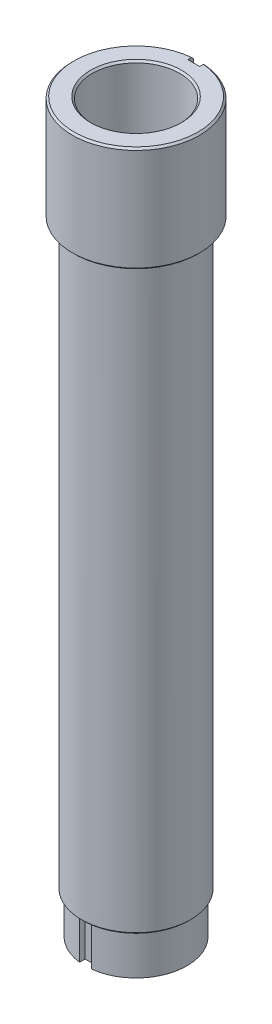
ISO-10303-21;
HEADER;
FILE_DESCRIPTION(('STEP AP214'),'2;1');
FILE_NAME('part.step','',(''),(''),'','','');
FILE_SCHEMA(('AUTOMOTIVE_DESIGN { 1 0 10303 214 1 1 1 1 }'));
ENDSEC;
DATA;
#1=APPLICATION_CONTEXT('core data for automotive mechanical design processes');
#2=APPLICATION_PROTOCOL_DEFINITION('international standard','automotive_design',2000,#1);
#3=PRODUCT_CONTEXT('',#1,'mechanical');
#4=PRODUCT('Part','Part','',(#3));
#5=PRODUCT_RELATED_PRODUCT_CATEGORY('part','',(#4));
#6=PRODUCT_DEFINITION_FORMATION('','',#4);
#7=PRODUCT_DEFINITION_CONTEXT('part definition',#1,'design');
#8=PRODUCT_DEFINITION('design','',#6,#7);
#9=PRODUCT_DEFINITION_SHAPE('','',#8);
#10=(LENGTH_UNIT() NAMED_UNIT(*) SI_UNIT(.MILLI.,.METRE.));
#11=(NAMED_UNIT(*) PLANE_ANGLE_UNIT() SI_UNIT($,.RADIAN.));
#12=(NAMED_UNIT(*) SI_UNIT($,.STERADIAN.) SOLID_ANGLE_UNIT());
#13=UNCERTAINTY_MEASURE_WITH_UNIT(LENGTH_MEASURE(1.E-05),#10,'distance_accuracy_value','');
#14=(GEOMETRIC_REPRESENTATION_CONTEXT(3) GLOBAL_UNCERTAINTY_ASSIGNED_CONTEXT((#13)) GLOBAL_UNIT_ASSIGNED_CONTEXT((#10,
#11,#12)) REPRESENTATION_CONTEXT('',''));
#15=CARTESIAN_POINT('',(0.,0.,0.));
#16=DIRECTION('',(0.,0.,1.));
#17=DIRECTION('',(1.,0.,0.));
#18=AXIS2_PLACEMENT_3D('',#15,#16,#17);
#19=CARTESIAN_POINT('',(0.,0.,0.));
#20=DIRECTION('',(0.,-1.,0.));
#21=DIRECTION('',(0.,0.,-1.));
#22=AXIS2_PLACEMENT_3D('',#19,#20,#21);
#23=CYLINDRICAL_SURFACE('',#22,15.);
#24=CARTESIAN_POINT('',(0.,170.5,0.));
#25=DIRECTION('',(0.,1.,0.));
#26=DIRECTION('',(0.,0.,1.));
#27=AXIS2_PLACEMENT_3D('',#24,#25,#26);
#28=CIRCLE('',#27,15.);
#29=CARTESIAN_POINT('',(0.,170.5,15.));
#30=VERTEX_POINT('',#29);
#31=EDGE_CURVE('E202',#30,#30,#28,.F.);
#32=ORIENTED_EDGE('',*,*,#31,.T.);
#33=EDGE_LOOP('',(#32));
#34=FACE_BOUND('',#33,.T.);
#35=CARTESIAN_POINT('',(0.,11.5,0.));
#36=DIRECTION('',(0.,-1.,0.));
#37=DIRECTION('',(0.,0.,-1.));
#38=AXIS2_PLACEMENT_3D('',#35,#36,#37);
#39=CIRCLE('',#38,15.);
#40=CARTESIAN_POINT('',(0.,11.5,-15.));
#41=VERTEX_POINT('',#40);
#42=EDGE_CURVE('E183',#41,#41,#39,.F.);
#43=ORIENTED_EDGE('',*,*,#42,.T.);
#44=EDGE_LOOP('',(#43));
#45=FACE_BOUND('',#44,.T.);
#46=ADVANCED_FACE('F33',(#34,#45),#23,.T.);
#47=CARTESIAN_POINT('',(12.,0.,0.));
#48=DIRECTION('',(0.,-1.,0.));
#49=DIRECTION('',(0.,0.,-1.));
#50=AXIS2_PLACEMENT_3D('',#47,#48,#49);
#51=PLANE('',#50);
#52=DIRECTION('',(0.,0.,1.));
#53=VECTOR('',#52,1.);
#54=CARTESIAN_POINT('',(1.625,0.,15.625));
#55=LINE('',#54,#53);
#56=CARTESIAN_POINT('',(1.625,0.,12.375));
#57=VERTEX_POINT('',#56);
#58=CARTESIAN_POINT('',(1.625,0.,13.9053721633044));
#59=VERTEX_POINT('',#58);
#60=EDGE_CURVE('E148',#57,#59,#55,.T.);
#61=ORIENTED_EDGE('',*,*,#60,.F.);
#62=DIRECTION('',(1.,0.,0.));
#63=VECTOR('',#62,1.);
#64=CARTESIAN_POINT('',(-1.625,0.,12.375));
#65=LINE('',#64,#63);
#66=CARTESIAN_POINT('',(-1.625,0.,12.375));
#67=VERTEX_POINT('',#66);
#68=EDGE_CURVE('E160',#67,#57,#65,.T.);
#69=ORIENTED_EDGE('',*,*,#68,.F.);
#70=DIRECTION('',(0.,0.,-1.));
#71=VECTOR('',#70,1.);
#72=CARTESIAN_POINT('',(-1.625,0.,15.625));
#73=LINE('',#72,#71);
#74=CARTESIAN_POINT('',(-1.625,0.,13.9053721633044));
#75=VERTEX_POINT('',#74);
#76=EDGE_CURVE('E158',#75,#67,#73,.T.);
#77=ORIENTED_EDGE('',*,*,#76,.F.);
#78=CARTESIAN_POINT('',(0.,0.,0.));
#79=DIRECTION('',(0.,-1.,0.));
#80=DIRECTION('',(0.,0.,-1.));
#81=AXIS2_PLACEMENT_3D('',#78,#79,#80);
#82=CIRCLE('',#81,14.);
#83=EDGE_CURVE('E177',#75,#59,#82,.T.);
#84=ORIENTED_EDGE('',*,*,#83,.T.);
#85=EDGE_LOOP('',(#61,#69,#77,#84));
#86=FACE_BOUND('',#85,.T.);
#87=CARTESIAN_POINT('',(0.,0.,0.));
#88=DIRECTION('',(0.,-1.,0.));
#89=DIRECTION('',(0.,0.,-1.));
#90=AXIS2_PLACEMENT_3D('',#87,#88,#89);
#91=CIRCLE('',#90,12.);
#92=CARTESIAN_POINT('',(0.,0.,-12.));
#93=VERTEX_POINT('',#92);
#94=EDGE_CURVE('E171',#93,#93,#91,.T.);
#95=ORIENTED_EDGE('',*,*,#94,.F.);
#96=EDGE_LOOP('',(#95));
#97=FACE_BOUND('',#96,.T.);
#98=ADVANCED_FACE('F254',(#86,#97),#51,.T.);
#99=CARTESIAN_POINT('',(0.,0.,0.));
#100=DIRECTION('',(0.,-1.,0.));
#101=DIRECTION('',(0.,0.,-1.));
#102=AXIS2_PLACEMENT_3D('',#99,#100,#101);
#103=CYLINDRICAL_SURFACE('',#102,14.);
#104=DIRECTION('',(0.,-1.,0.));
#105=VECTOR('',#104,1.);
#106=CARTESIAN_POINT('',(1.625,0.,13.9053721633044));
#107=LINE('',#106,#105);
#108=CARTESIAN_POINT('',(1.625,11.,13.9053721633044));
#109=VERTEX_POINT('',#108);
#110=EDGE_CURVE('E168',#59,#109,#107,.F.);
#111=ORIENTED_EDGE('',*,*,#110,.F.);
#112=ORIENTED_EDGE('',*,*,#83,.F.);
#113=DIRECTION('',(0.,-1.,0.));
#114=VECTOR('',#113,1.);
#115=CARTESIAN_POINT('',(-1.625,0.,13.9053721633044));
#116=LINE('',#115,#114);
#117=CARTESIAN_POINT('',(-1.625,11.,13.9053721633044));
#118=VERTEX_POINT('',#117);
#119=EDGE_CURVE('E156',#118,#75,#116,.T.);
#120=ORIENTED_EDGE('',*,*,#119,.F.);
#121=CARTESIAN_POINT('',(0.,11.,0.));
#122=DIRECTION('',(0.,-1.,0.));
#123=DIRECTION('',(0.,0.,-1.));
#124=AXIS2_PLACEMENT_3D('',#121,#122,#123);
#125=CIRCLE('',#124,14.);
#126=EDGE_CURVE('E174',#118,#109,#125,.T.);
#127=ORIENTED_EDGE('',*,*,#126,.T.);
#128=EDGE_LOOP('',(#111,#112,#120,#127));
#129=FACE_BOUND('',#128,.T.);
#130=ADVANCED_FACE('F258',(#129),#103,.T.);
#131=CARTESIAN_POINT('',(14.,11.,0.));
#132=DIRECTION('',(0.,-1.,0.));
#133=DIRECTION('',(0.,0.,-1.));
#134=AXIS2_PLACEMENT_3D('',#131,#132,#133);
#135=PLANE('',#134);
#136=CARTESIAN_POINT('',(0.,11.,0.));
#137=DIRECTION('',(0.,-1.,0.));
#138=DIRECTION('',(0.,0.,-1.));
#139=AXIS2_PLACEMENT_3D('',#136,#137,#138);
#140=CIRCLE('',#139,14.5);
#141=CARTESIAN_POINT('',(0.,11.,-14.5));
#142=VERTEX_POINT('',#141);
#143=EDGE_CURVE('E180',#142,#142,#140,.T.);
#144=ORIENTED_EDGE('',*,*,#143,.T.);
#145=EDGE_LOOP('',(#144));
#146=FACE_BOUND('',#145,.T.);
#147=ORIENTED_EDGE('',*,*,#126,.F.);
#148=DIRECTION('',(0.,0.,1.));
#149=VECTOR('',#148,1.);
#150=CARTESIAN_POINT('',(-1.625,11.,15.625));
#151=LINE('',#150,#149);
#152=CARTESIAN_POINT('',(-1.625,11.,12.375));
#153=VERTEX_POINT('',#152);
#154=EDGE_CURVE('E149',#153,#118,#151,.T.);
#155=ORIENTED_EDGE('',*,*,#154,.F.);
#156=DIRECTION('',(-1.,0.,0.));
#157=VECTOR('',#156,1.);
#158=CARTESIAN_POINT('',(-1.625,11.,12.375));
#159=LINE('',#158,#157);
#160=CARTESIAN_POINT('',(1.625,11.,12.375));
#161=VERTEX_POINT('',#160);
#162=EDGE_CURVE('E151',#161,#153,#159,.T.);
#163=ORIENTED_EDGE('',*,*,#162,.F.);
#164=DIRECTION('',(0.,0.,-1.));
#165=VECTOR('',#164,1.);
#166=CARTESIAN_POINT('',(1.625,11.,15.625));
#167=LINE('',#166,#165);
#168=EDGE_CURVE('E154',#109,#161,#167,.T.);
#169=ORIENTED_EDGE('',*,*,#168,.F.);
#170=EDGE_LOOP('',(#147,#155,#163,#169));
#171=FACE_BOUND('',#170,.T.);
#172=ADVANCED_FACE('F250',(#146,#171),#135,.T.);
#173=CARTESIAN_POINT('',(12.,200.,0.));
#174=DIRECTION('',(0.,1.,0.));
#175=DIRECTION('',(0.,0.,1.));
#176=AXIS2_PLACEMENT_3D('',#173,#174,#175);
#177=PLANE('',#176);
#178=CARTESIAN_POINT('',(0.,200.,0.));
#179=DIRECTION('',(0.,1.,0.));
#180=DIRECTION('',(0.,0.,1.));
#181=AXIS2_PLACEMENT_3D('',#178,#179,#180);
#182=CIRCLE('',#181,12.5);
#183=CARTESIAN_POINT('',(0.,200.,12.5));
#184=VERTEX_POINT('',#183);
#185=EDGE_CURVE('E191',#184,#184,#182,.F.);
#186=ORIENTED_EDGE('',*,*,#185,.T.);
#187=EDGE_LOOP('',(#186));
#188=FACE_BOUND('',#187,.T.);
#189=DIRECTION('',(0.,0.,1.));
#190=VECTOR('',#189,1.);
#191=CARTESIAN_POINT('',(-1.625,200.,-19.125));
#192=LINE('',#191,#190);
#193=CARTESIAN_POINT('',(-1.625,200.,-16.9221563342265));
#194=VERTEX_POINT('',#193);
#195=CARTESIAN_POINT('',(-1.625,200.,-15.875));
#196=VERTEX_POINT('',#195);
#197=EDGE_CURVE('E113',#194,#196,#192,.T.);
#198=ORIENTED_EDGE('',*,*,#197,.F.);
#199=CARTESIAN_POINT('',(0.,200.,0.));
#200=DIRECTION('',(0.,1.,0.));
#201=DIRECTION('',(0.,0.,1.));
#202=AXIS2_PLACEMENT_3D('',#199,#200,#201);
#203=CIRCLE('',#202,17.0000000000001);
#204=CARTESIAN_POINT('',(1.625,200.,-16.9221563342265));
#205=VERTEX_POINT('',#204);
#206=EDGE_CURVE('E189',#194,#205,#203,.T.);
#207=ORIENTED_EDGE('',*,*,#206,.T.);
#208=DIRECTION('',(0.,0.,-1.));
#209=VECTOR('',#208,1.);
#210=CARTESIAN_POINT('',(1.625,200.,-19.125));
#211=LINE('',#210,#209);
#212=CARTESIAN_POINT('',(1.625,200.,-15.875));
#213=VERTEX_POINT('',#212);
#214=EDGE_CURVE('E124',#213,#205,#211,.T.);
#215=ORIENTED_EDGE('',*,*,#214,.F.);
#216=DIRECTION('',(1.,0.,0.));
#217=VECTOR('',#216,1.);
#218=CARTESIAN_POINT('',(-1.625,200.,-15.875));
#219=LINE('',#218,#217);
#220=EDGE_CURVE('E123',#196,#213,#219,.T.);
#221=ORIENTED_EDGE('',*,*,#220,.F.);
#222=EDGE_LOOP('',(#198,#207,#215,#221));
#223=FACE_BOUND('',#222,.T.);
#224=ADVANCED_FACE('F136',(#188,#223),#177,.T.);
#225=CARTESIAN_POINT('',(0.,0.,0.));
#226=DIRECTION('',(0.,-1.,0.));
#227=DIRECTION('',(0.,0.,-1.));
#228=AXIS2_PLACEMENT_3D('',#225,#226,#227);
#229=CYLINDRICAL_SURFACE('',#228,12.);
#230=CARTESIAN_POINT('',(0.,199.5,0.));
#231=DIRECTION('',(0.,1.,0.));
#232=DIRECTION('',(0.,0.,1.));
#233=AXIS2_PLACEMENT_3D('',#230,#231,#232);
#234=CIRCLE('',#233,12.);
#235=CARTESIAN_POINT('',(0.,199.5,12.));
#236=VERTEX_POINT('',#235);
#237=EDGE_CURVE('E194',#236,#236,#234,.T.);
#238=ORIENTED_EDGE('',*,*,#237,.T.);
#239=EDGE_LOOP('',(#238));
#240=FACE_BOUND('',#239,.T.);
#241=ORIENTED_EDGE('',*,*,#94,.T.);
#242=EDGE_LOOP('',(#241));
#243=FACE_BOUND('',#242,.T.);
#244=ADVANCED_FACE('F243',(#240,#243),#229,.F.);
#245=CARTESIAN_POINT('',(1.625,15.5961940777126,15.625));
#246=DIRECTION('',(1.,0.,0.));
#247=DIRECTION('',(0.,0.,-1.));
#248=AXIS2_PLACEMENT_3D('',#245,#246,#247);
#249=PLANE('',#248);
#250=ORIENTED_EDGE('',*,*,#110,.T.);
#251=ORIENTED_EDGE('',*,*,#168,.T.);
#252=DIRECTION('',(0.,-1.,0.));
#253=VECTOR('',#252,1.);
#254=CARTESIAN_POINT('',(1.625,15.5961940777126,12.375));
#255=LINE('',#254,#253);
#256=EDGE_CURVE('E152',#161,#57,#255,.T.);
#257=ORIENTED_EDGE('',*,*,#256,.T.);
#258=ORIENTED_EDGE('',*,*,#60,.T.);
#259=EDGE_LOOP('',(#250,#251,#257,#258));
#260=FACE_BOUND('',#259,.T.);
#261=ADVANCED_FACE('F236',(#260),#249,.F.);
#262=CARTESIAN_POINT('',(-1.625,15.5961940777126,12.375));
#263=DIRECTION('',(0.,0.,-1.));
#264=DIRECTION('',(-1.,0.,0.));
#265=AXIS2_PLACEMENT_3D('',#262,#263,#264);
#266=PLANE('',#265);
#267=ORIENTED_EDGE('',*,*,#162,.T.);
#268=DIRECTION('',(0.,-1.,0.));
#269=VECTOR('',#268,1.);
#270=CARTESIAN_POINT('',(-1.625,15.5961940777126,12.375));
#271=LINE('',#270,#269);
#272=EDGE_CURVE('E163',#153,#67,#271,.T.);
#273=ORIENTED_EDGE('',*,*,#272,.T.);
#274=ORIENTED_EDGE('',*,*,#68,.T.);
#275=ORIENTED_EDGE('',*,*,#256,.F.);
#276=EDGE_LOOP('',(#267,#273,#274,#275));
#277=FACE_BOUND('',#276,.T.);
#278=ADVANCED_FACE('F232',(#277),#266,.F.);
#279=CARTESIAN_POINT('',(-1.625,15.5961940777126,15.625));
#280=DIRECTION('',(-1.,0.,0.));
#281=DIRECTION('',(0.,0.,1.));
#282=AXIS2_PLACEMENT_3D('',#279,#280,#281);
#283=PLANE('',#282);
#284=ORIENTED_EDGE('',*,*,#119,.T.);
#285=ORIENTED_EDGE('',*,*,#76,.T.);
#286=ORIENTED_EDGE('',*,*,#272,.F.);
#287=ORIENTED_EDGE('',*,*,#154,.T.);
#288=EDGE_LOOP('',(#284,#285,#286,#287));
#289=FACE_BOUND('',#288,.T.);
#290=ADVANCED_FACE('F235',(#289),#283,.F.);
#291=CARTESIAN_POINT('',(0.,11.,0.));
#292=DIRECTION('',(0.,1.,0.));
#293=DIRECTION('',(0.,0.,1.));
#294=AXIS2_PLACEMENT_3D('',#291,#292,#293);
#295=CONICAL_SURFACE('',#294,14.5,0.785398163397453);
#296=ORIENTED_EDGE('',*,*,#42,.F.);
#297=EDGE_LOOP('',(#296));
#298=FACE_BOUND('',#297,.T.);
#299=ORIENTED_EDGE('',*,*,#143,.F.);
#300=EDGE_LOOP('',(#299));
#301=FACE_BOUND('',#300,.T.);
#302=ADVANCED_FACE('F231',(#298,#301),#295,.T.);
#303=CARTESIAN_POINT('',(0.,171.,0.));
#304=DIRECTION('',(0.,1.,0.));
#305=DIRECTION('',(0.,0.,1.));
#306=AXIS2_PLACEMENT_3D('',#303,#304,#305);
#307=CYLINDRICAL_SURFACE('',#306,17.5);
#308=DIRECTION('',(0.,1.,0.));
#309=VECTOR('',#308,1.);
#310=CARTESIAN_POINT('',(1.625,171.,-17.4243902332334));
#311=LINE('',#310,#309);
#312=CARTESIAN_POINT('',(1.625,199.5,-17.4243902332334));
#313=VERTEX_POINT('',#312);
#314=CARTESIAN_POINT('',(1.625,171.5,-17.4243902332334));
#315=VERTEX_POINT('',#314);
#316=EDGE_CURVE('E145',#313,#315,#311,.F.);
#317=ORIENTED_EDGE('',*,*,#316,.F.);
#318=CARTESIAN_POINT('',(0.,199.5,0.));
#319=DIRECTION('',(0.,1.,0.));
#320=DIRECTION('',(0.,0.,1.));
#321=AXIS2_PLACEMENT_3D('',#318,#319,#320);
#322=CIRCLE('',#321,17.5);
#323=CARTESIAN_POINT('',(-1.625,199.5,-17.4243902332334));
#324=VERTEX_POINT('',#323);
#325=EDGE_CURVE('E53',#313,#324,#322,.F.);
#326=ORIENTED_EDGE('',*,*,#325,.T.);
#327=DIRECTION('',(0.,1.,0.));
#328=VECTOR('',#327,1.);
#329=CARTESIAN_POINT('',(-1.625,171.,-17.4243902332334));
#330=LINE('',#329,#328);
#331=CARTESIAN_POINT('',(-1.625,171.5,-17.4243902332334));
#332=VERTEX_POINT('',#331);
#333=EDGE_CURVE('E143',#332,#324,#330,.T.);
#334=ORIENTED_EDGE('',*,*,#333,.F.);
#335=CARTESIAN_POINT('',(0.,171.5,0.));
#336=DIRECTION('',(0.,1.,0.));
#337=DIRECTION('',(0.,0.,1.));
#338=AXIS2_PLACEMENT_3D('',#335,#336,#337);
#339=CIRCLE('',#338,17.5);
#340=EDGE_CURVE('E291',#332,#315,#339,.T.);
#341=ORIENTED_EDGE('',*,*,#340,.T.);
#342=EDGE_LOOP('',(#317,#326,#334,#341));
#343=FACE_BOUND('',#342,.T.);
#344=ADVANCED_FACE('F227',(#343),#307,.T.);
#345=CARTESIAN_POINT('',(0.,171.,0.));
#346=DIRECTION('',(0.,1.,0.));
#347=DIRECTION('',(0.,0.,1.));
#348=AXIS2_PLACEMENT_3D('',#345,#346,#347);
#349=PLANE('',#348);
#350=CARTESIAN_POINT('',(0.,171.,0.));
#351=DIRECTION('',(0.,1.,0.));
#352=DIRECTION('',(0.,0.,1.));
#353=AXIS2_PLACEMENT_3D('',#350,#351,#352);
#354=CIRCLE('',#353,15.5);
#355=CARTESIAN_POINT('',(0.,171.,15.5));
#356=VERTEX_POINT('',#355);
#357=EDGE_CURVE('E199',#356,#356,#354,.T.);
#358=ORIENTED_EDGE('',*,*,#357,.T.);
#359=EDGE_LOOP('',(#358));
#360=FACE_BOUND('',#359,.T.);
#361=DIRECTION('',(0.,0.,-1.));
#362=VECTOR('',#361,1.);
#363=CARTESIAN_POINT('',(1.625,171.,0.));
#364=LINE('',#363,#362);
#365=CARTESIAN_POINT('',(1.625,171.,-15.875));
#366=VERTEX_POINT('',#365);
#367=CARTESIAN_POINT('',(1.625,171.,-16.9221563342264));
#368=VERTEX_POINT('',#367);
#369=EDGE_CURVE('E186',#366,#368,#364,.T.);
#370=ORIENTED_EDGE('',*,*,#369,.T.);
#371=CARTESIAN_POINT('',(0.,171.,0.));
#372=DIRECTION('',(0.,1.,0.));
#373=DIRECTION('',(0.,0.,1.));
#374=AXIS2_PLACEMENT_3D('',#371,#372,#373);
#375=CIRCLE('',#374,16.9999999999999);
#376=CARTESIAN_POINT('',(-1.625,171.,-16.9221563342264));
#377=VERTEX_POINT('',#376);
#378=EDGE_CURVE('E197',#368,#377,#375,.F.);
#379=ORIENTED_EDGE('',*,*,#378,.T.);
#380=DIRECTION('',(0.,0.,-1.));
#381=VECTOR('',#380,1.);
#382=CARTESIAN_POINT('',(-1.625,171.,-19.125));
#383=LINE('',#382,#381);
#384=CARTESIAN_POINT('',(-1.625,171.,-15.875));
#385=VERTEX_POINT('',#384);
#386=EDGE_CURVE('E141',#385,#377,#383,.T.);
#387=ORIENTED_EDGE('',*,*,#386,.F.);
#388=DIRECTION('',(-1.,0.,0.));
#389=VECTOR('',#388,1.);
#390=CARTESIAN_POINT('',(-1.625,171.,-15.875));
#391=LINE('',#390,#389);
#392=EDGE_CURVE('E132',#366,#385,#391,.T.);
#393=ORIENTED_EDGE('',*,*,#392,.F.);
#394=EDGE_LOOP('',(#370,#379,#387,#393));
#395=FACE_BOUND('',#394,.T.);
#396=ADVANCED_FACE('F220',(#360,#395),#349,.F.);
#397=CARTESIAN_POINT('',(1.625,166.403805922287,-19.125));
#398=DIRECTION('',(1.,0.,0.));
#399=DIRECTION('',(0.,0.,-1.));
#400=AXIS2_PLACEMENT_3D('',#397,#398,#399);
#401=PLANE('',#400);
#402=ORIENTED_EDGE('',*,*,#214,.T.);
#403=CARTESIAN_POINT('',(1.625,200.,-16.9221563342265));
#404=CARTESIAN_POINT('',(1.625,199.916672098718,-17.0058673919537));
#405=CARTESIAN_POINT('',(1.625,199.83334148141,-17.0895757457352));
#406=CARTESIAN_POINT('',(1.625,199.666674814743,-17.2569870454042));
#407=CARTESIAN_POINT('',(1.625,199.583338765385,-17.3406899912917));
#408=CARTESIAN_POINT('',(1.625,199.5,-17.4243902332334));
#409=B_SPLINE_CURVE_WITH_KNOTS('',3,(#403,#404,#405,#406,#407,#408),.UNSPECIFIED.,.F.,.F.,(4,2,
4),(0.,0.354344073555546,0.708688147100259),.UNSPECIFIED.);
#410=EDGE_CURVE('E211',#205,#313,#409,.T.);
#411=ORIENTED_EDGE('',*,*,#410,.T.);
#412=ORIENTED_EDGE('',*,*,#316,.T.);
#413=CARTESIAN_POINT('',(1.625,171.5,-17.4243902332334));
#414=CARTESIAN_POINT('',(1.625,171.416661234615,-17.3406899912917));
#415=CARTESIAN_POINT('',(1.625,171.333325185257,-17.2569870454042));
#416=CARTESIAN_POINT('',(1.625,171.16665851859,-17.0895757457352));
#417=CARTESIAN_POINT('',(1.625,171.083327901282,-17.0058673919536));
#418=CARTESIAN_POINT('',(1.625,171.,-16.9221563342264));
#419=B_SPLINE_CURVE_WITH_KNOTS('',3,(#413,#414,#415,#416,#417,#418),.UNSPECIFIED.,.F.,.F.,(4,2,
4),(0.,0.354344073544819,0.708688147100456),.UNSPECIFIED.);
#420=EDGE_CURVE('E205',#315,#368,#419,.T.);
#421=ORIENTED_EDGE('',*,*,#420,.T.);
#422=ORIENTED_EDGE('',*,*,#369,.F.);
#423=DIRECTION('',(0.,1.,0.));
#424=VECTOR('',#423,1.);
#425=CARTESIAN_POINT('',(1.625,166.403805922287,-15.875));
#426=LINE('',#425,#424);
#427=EDGE_CURVE('E134',#366,#213,#426,.T.);
#428=ORIENTED_EDGE('',*,*,#427,.T.);
#429=EDGE_LOOP('',(#402,#411,#412,#421,#422,#428));
#430=FACE_BOUND('',#429,.T.);
#431=ADVANCED_FACE('F216',(#430),#401,.F.);
#432=CARTESIAN_POINT('',(-1.625,166.403805922287,-15.875));
#433=DIRECTION('',(0.,0.,1.));
#434=DIRECTION('',(1.,0.,0.));
#435=AXIS2_PLACEMENT_3D('',#432,#433,#434);
#436=PLANE('',#435);
#437=ORIENTED_EDGE('',*,*,#392,.T.);
#438=DIRECTION('',(0.,1.,0.));
#439=VECTOR('',#438,1.);
#440=CARTESIAN_POINT('',(-1.625,166.403805922287,-15.875));
#441=LINE('',#440,#439);
#442=EDGE_CURVE('E116',#385,#196,#441,.T.);
#443=ORIENTED_EDGE('',*,*,#442,.T.);
#444=ORIENTED_EDGE('',*,*,#220,.T.);
#445=ORIENTED_EDGE('',*,*,#427,.F.);
#446=EDGE_LOOP('',(#437,#443,#444,#445));
#447=FACE_BOUND('',#446,.T.);
#448=ADVANCED_FACE('F128',(#447),#436,.F.);
#449=CARTESIAN_POINT('',(-1.625,166.403805922287,-19.125));
#450=DIRECTION('',(-1.,0.,0.));
#451=DIRECTION('',(0.,0.,1.));
#452=AXIS2_PLACEMENT_3D('',#449,#450,#451);
#453=PLANE('',#452);
#454=ORIENTED_EDGE('',*,*,#333,.T.);
#455=CARTESIAN_POINT('',(-1.625,199.5,-17.4243902332334));
#456=CARTESIAN_POINT('',(-1.625,199.583338765385,-17.3406899912917));
#457=CARTESIAN_POINT('',(-1.625,199.666674814743,-17.2569870454042));
#458=CARTESIAN_POINT('',(-1.625,199.83334148141,-17.0895757457352));
#459=CARTESIAN_POINT('',(-1.625,199.916672098718,-17.0058673919537));
#460=CARTESIAN_POINT('',(-1.625,200.,-16.9221563342265));
#461=B_SPLINE_CURVE_WITH_KNOTS('',3,(#455,#456,#457,#458,#459,#460),.UNSPECIFIED.,.F.,.F.,(4,2,
4),(0.,0.354344073544716,0.708688147100262),.UNSPECIFIED.);
#462=EDGE_CURVE('E11',#324,#194,#461,.T.);
#463=ORIENTED_EDGE('',*,*,#462,.T.);
#464=ORIENTED_EDGE('',*,*,#197,.T.);
#465=ORIENTED_EDGE('',*,*,#442,.F.);
#466=ORIENTED_EDGE('',*,*,#386,.T.);
#467=CARTESIAN_POINT('',(-1.625,171.,-16.9221563342264));
#468=CARTESIAN_POINT('',(-1.625,171.083327901282,-17.0058673919536));
#469=CARTESIAN_POINT('',(-1.625,171.16665851859,-17.0895757457352));
#470=CARTESIAN_POINT('',(-1.625,171.333325185257,-17.2569870454042));
#471=CARTESIAN_POINT('',(-1.625,171.416661234615,-17.3406899912917));
#472=CARTESIAN_POINT('',(-1.625,171.5,-17.4243902332334));
#473=B_SPLINE_CURVE_WITH_KNOTS('',3,(#467,#468,#469,#470,#471,#472),.UNSPECIFIED.,.F.,.F.,(4,2,
4),(0.,0.354344073555639,0.708688147100455),.UNSPECIFIED.);
#474=EDGE_CURVE('E46',#377,#332,#473,.T.);
#475=ORIENTED_EDGE('',*,*,#474,.T.);
#476=EDGE_LOOP('',(#454,#463,#464,#465,#466,#475));
#477=FACE_BOUND('',#476,.T.);
#478=ADVANCED_FACE('F115',(#477),#453,.F.);
#479=CARTESIAN_POINT('',(0.,200.,0.));
#480=DIRECTION('',(0.,1.,0.));
#481=DIRECTION('',(0.,0.,1.));
#482=AXIS2_PLACEMENT_3D('',#479,#480,#481);
#483=CONICAL_SURFACE('',#482,12.5,0.785398163397441);
#484=ORIENTED_EDGE('',*,*,#237,.F.);
#485=EDGE_LOOP('',(#484));
#486=FACE_BOUND('',#485,.T.);
#487=ORIENTED_EDGE('',*,*,#185,.F.);
#488=EDGE_LOOP('',(#487));
#489=FACE_BOUND('',#488,.T.);
#490=ADVANCED_FACE('F269',(#486,#489),#483,.F.);
#491=CARTESIAN_POINT('',(0.,171.,0.));
#492=DIRECTION('',(0.,1.,0.));
#493=DIRECTION('',(0.,0.,1.));
#494=AXIS2_PLACEMENT_3D('',#491,#492,#493);
#495=CONICAL_SURFACE('',#494,15.5,0.785398163397462);
#496=ORIENTED_EDGE('',*,*,#31,.F.);
#497=EDGE_LOOP('',(#496));
#498=FACE_BOUND('',#497,.T.);
#499=ORIENTED_EDGE('',*,*,#357,.F.);
#500=EDGE_LOOP('',(#499));
#501=FACE_BOUND('',#500,.T.);
#502=ADVANCED_FACE('F272',(#498,#501),#495,.T.);
#503=CARTESIAN_POINT('',(0.,200.,0.));
#504=DIRECTION('',(0.,-1.,0.));
#505=DIRECTION('',(0.,0.,-1.));
#506=AXIS2_PLACEMENT_3D('',#503,#504,#505);
#507=CONICAL_SURFACE('',#506,17.0000000000001,0.785398163397441);
#508=ORIENTED_EDGE('',*,*,#462,.F.);
#509=ORIENTED_EDGE('',*,*,#325,.F.);
#510=ORIENTED_EDGE('',*,*,#410,.F.);
#511=ORIENTED_EDGE('',*,*,#206,.F.);
#512=EDGE_LOOP('',(#508,#509,#510,#511));
#513=FACE_BOUND('',#512,.T.);
#514=ADVANCED_FACE('F275',(#513),#507,.T.);
#515=CARTESIAN_POINT('',(0.,171.5,0.));
#516=DIRECTION('',(0.,1.,0.));
#517=DIRECTION('',(0.,0.,1.));
#518=AXIS2_PLACEMENT_3D('',#515,#516,#517);
#519=CONICAL_SURFACE('',#518,17.5,0.785398163397441);
#520=ORIENTED_EDGE('',*,*,#474,.F.);
#521=ORIENTED_EDGE('',*,*,#378,.F.);
#522=ORIENTED_EDGE('',*,*,#420,.F.);
#523=ORIENTED_EDGE('',*,*,#340,.F.);
#524=EDGE_LOOP('',(#520,#521,#522,#523));
#525=FACE_BOUND('',#524,.T.);
#526=ADVANCED_FACE('F35',(#525),#519,.T.);
#527=CLOSED_SHELL('',(#46,#98,#130,#172,#224,#244,#261,#278,#290,#302,#344,#396,#431,#448,#478,
#490,#502,#514,#526));
#528=MANIFOLD_SOLID_BREP('B2',#527);
#529=ADVANCED_BREP_SHAPE_REPRESENTATION('',(#18,#528),#14);
#530=SHAPE_DEFINITION_REPRESENTATION(#9,#529);
ENDSEC;
END-ISO-10303-21;
